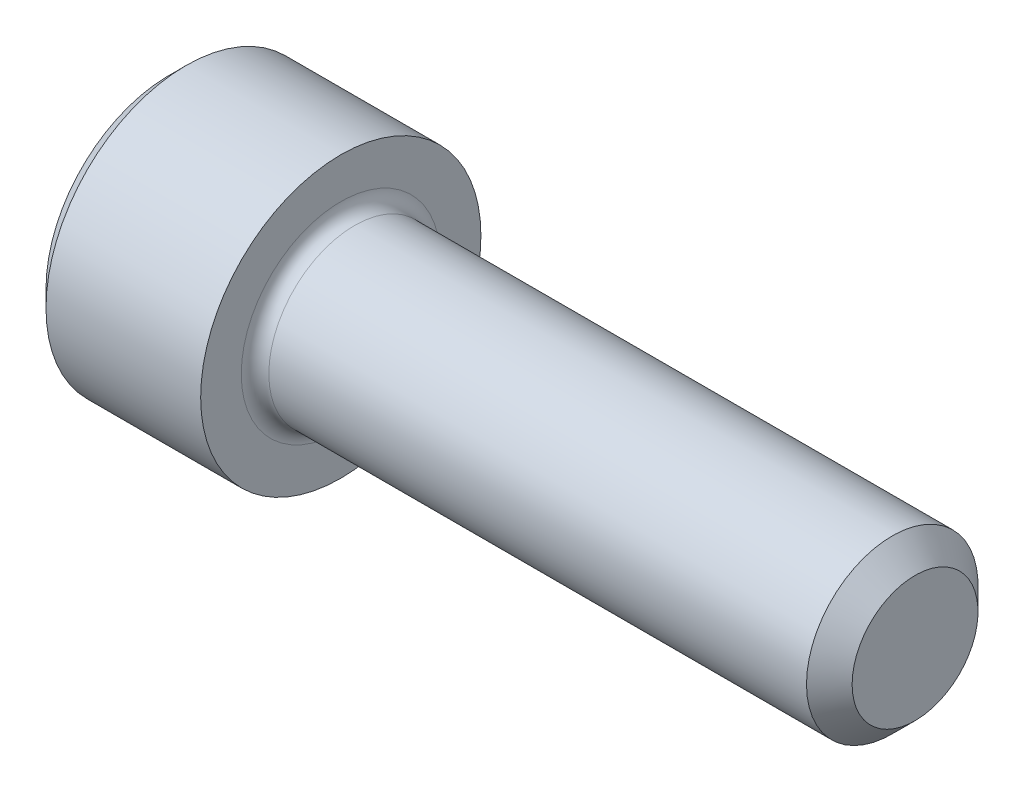
ISO-10303-21;
HEADER;
FILE_DESCRIPTION(('STEP AP214'),'2;1');
FILE_NAME('part.step','',(''),(''),'','','');
FILE_SCHEMA(('AUTOMOTIVE_DESIGN { 1 0 10303 214 1 1 1 1 }'));
ENDSEC;
DATA;
#1=APPLICATION_CONTEXT('core data for automotive mechanical design processes');
#2=APPLICATION_PROTOCOL_DEFINITION('international standard','automotive_design',2000,#1);
#3=PRODUCT_CONTEXT('',#1,'mechanical');
#4=PRODUCT('Part','Part','',(#3));
#5=PRODUCT_RELATED_PRODUCT_CATEGORY('part','',(#4));
#6=PRODUCT_DEFINITION_FORMATION('','',#4);
#7=PRODUCT_DEFINITION_CONTEXT('part definition',#1,'design');
#8=PRODUCT_DEFINITION('design','',#6,#7);
#9=PRODUCT_DEFINITION_SHAPE('','',#8);
#10=(LENGTH_UNIT() NAMED_UNIT(*) SI_UNIT(.MILLI.,.METRE.));
#11=(NAMED_UNIT(*) PLANE_ANGLE_UNIT() SI_UNIT($,.RADIAN.));
#12=(NAMED_UNIT(*) SI_UNIT($,.STERADIAN.) SOLID_ANGLE_UNIT());
#13=UNCERTAINTY_MEASURE_WITH_UNIT(LENGTH_MEASURE(1.E-05),#10,'distance_accuracy_value','');
#14=(GEOMETRIC_REPRESENTATION_CONTEXT(3) GLOBAL_UNCERTAINTY_ASSIGNED_CONTEXT((#13)) GLOBAL_UNIT_ASSIGNED_CONTEXT((#10,
#11,#12)) REPRESENTATION_CONTEXT('',''));
#15=CARTESIAN_POINT('',(0.,0.,0.));
#16=DIRECTION('',(0.,0.,1.));
#17=DIRECTION('',(1.,0.,0.));
#18=AXIS2_PLACEMENT_3D('',#15,#16,#17);
#19=CARTESIAN_POINT('',(0.,0.,0.));
#20=DIRECTION('',(-1.,0.,0.));
#21=DIRECTION('',(0.,0.,1.));
#22=AXIS2_PLACEMENT_3D('',#19,#20,#21);
#23=PLANE('',#22);
#24=DIRECTION('',(0.,-0.499999999999999,0.866025403784439));
#25=VECTOR('',#24,1.);
#26=CARTESIAN_POINT('',(0.,1.37848150271716,0.));
#27=LINE('',#26,#25);
#28=CARTESIAN_POINT('',(0.,1.37848150271716,0.));
#29=VERTEX_POINT('',#28);
#30=CARTESIAN_POINT('',(0.,0.689240751358582,1.1938));
#31=VERTEX_POINT('',#30);
#32=EDGE_CURVE('E121',#29,#31,#27,.T.);
#33=ORIENTED_EDGE('',*,*,#32,.T.);
#34=DIRECTION('',(0.,1.,0.));
#35=VECTOR('',#34,1.);
#36=CARTESIAN_POINT('',(0.,-0.689240751358569,1.1938));
#37=LINE('',#36,#35);
#38=CARTESIAN_POINT('',(0.,-0.689240751358569,1.1938));
#39=VERTEX_POINT('',#38);
#40=EDGE_CURVE('E110',#39,#31,#37,.T.);
#41=ORIENTED_EDGE('',*,*,#40,.F.);
#42=DIRECTION('',(0.,-0.500000000000001,-0.866025403784438));
#43=VECTOR('',#42,1.);
#44=CARTESIAN_POINT('',(0.,-0.689240751358569,1.1938));
#45=LINE('',#44,#43);
#46=CARTESIAN_POINT('',(0.,-1.37848150271715,0.));
#47=VERTEX_POINT('',#46);
#48=EDGE_CURVE('E120',#39,#47,#45,.T.);
#49=ORIENTED_EDGE('',*,*,#48,.T.);
#50=DIRECTION('',(0.,0.499999999999999,-0.866025403784439));
#51=VECTOR('',#50,1.);
#52=CARTESIAN_POINT('',(0.,-1.37848150271715,0.));
#53=LINE('',#52,#51);
#54=CARTESIAN_POINT('',(0.,-0.689240751358572,-1.1938));
#55=VERTEX_POINT('',#54);
#56=EDGE_CURVE('E135',#47,#55,#53,.T.);
#57=ORIENTED_EDGE('',*,*,#56,.T.);
#58=DIRECTION('',(0.,-1.,0.));
#59=VECTOR('',#58,1.);
#60=CARTESIAN_POINT('',(0.,0.689240751358578,-1.1938));
#61=LINE('',#60,#59);
#62=CARTESIAN_POINT('',(0.,0.689240751358578,-1.1938));
#63=VERTEX_POINT('',#62);
#64=EDGE_CURVE('E138',#63,#55,#61,.T.);
#65=ORIENTED_EDGE('',*,*,#64,.F.);
#66=DIRECTION('',(0.,-0.500000000000001,-0.866025403784438));
#67=VECTOR('',#66,1.);
#68=CARTESIAN_POINT('',(0.,1.37848150271716,0.));
#69=LINE('',#68,#67);
#70=EDGE_CURVE('E130',#29,#63,#69,.T.);
#71=ORIENTED_EDGE('',*,*,#70,.F.);
#72=EDGE_LOOP('',(#33,#41,#49,#57,#65,#71));
#73=FACE_BOUND('',#72,.T.);
#74=CARTESIAN_POINT('',(0.,0.,0.));
#75=DIRECTION('',(-1.,0.,0.));
#76=DIRECTION('',(0.,0.,1.));
#77=AXIS2_PLACEMENT_3D('',#74,#75,#76);
#78=CIRCLE('',#77,2.04469999999999);
#79=CARTESIAN_POINT('',(0.,0.,2.04469999999999));
#80=VERTEX_POINT('',#79);
#81=EDGE_CURVE('E190',#80,#80,#78,.T.);
#82=ORIENTED_EDGE('',*,*,#81,.T.);
#83=EDGE_LOOP('',(#82));
#84=FACE_BOUND('',#83,.T.);
#85=ADVANCED_FACE('F38',(#73,#84),#23,.T.);
#86=CARTESIAN_POINT('',(0.,0.,0.));
#87=DIRECTION('',(1.,0.,0.));
#88=DIRECTION('',(0.,0.,-1.));
#89=AXIS2_PLACEMENT_3D('',#86,#87,#88);
#90=CONICAL_SURFACE('',#89,2.04469999999999,0.785398163397459);
#91=CARTESIAN_POINT('',(0.279400000000006,0.,0.));
#92=DIRECTION('',(-1.,0.,0.));
#93=DIRECTION('',(0.,0.,1.));
#94=AXIS2_PLACEMENT_3D('',#91,#92,#93);
#95=CIRCLE('',#94,2.3241);
#96=CARTESIAN_POINT('',(0.279400000000006,0.,2.3241));
#97=VERTEX_POINT('',#96);
#98=EDGE_CURVE('E187',#97,#97,#95,.T.);
#99=ORIENTED_EDGE('',*,*,#98,.T.);
#100=EDGE_LOOP('',(#99));
#101=FACE_BOUND('',#100,.T.);
#102=ORIENTED_EDGE('',*,*,#81,.F.);
#103=EDGE_LOOP('',(#102));
#104=FACE_BOUND('',#103,.T.);
#105=ADVANCED_FACE('F214',(#101,#104),#90,.T.);
#106=CARTESIAN_POINT('',(-31.75,0.,0.));
#107=DIRECTION('',(-1.,0.,0.));
#108=DIRECTION('',(0.,0.,1.));
#109=AXIS2_PLACEMENT_3D('',#106,#107,#108);
#110=CYLINDRICAL_SURFACE('',#109,2.3241);
#111=CARTESIAN_POINT('',(2.84480000000001,0.,0.));
#112=DIRECTION('',(-1.,0.,0.));
#113=DIRECTION('',(0.,0.,1.));
#114=AXIS2_PLACEMENT_3D('',#111,#112,#113);
#115=CIRCLE('',#114,2.3241);
#116=CARTESIAN_POINT('',(2.84480000000001,0.,2.3241));
#117=VERTEX_POINT('',#116);
#118=EDGE_CURVE('E184',#117,#117,#115,.T.);
#119=ORIENTED_EDGE('',*,*,#118,.T.);
#120=EDGE_LOOP('',(#119));
#121=FACE_BOUND('',#120,.T.);
#122=ORIENTED_EDGE('',*,*,#98,.F.);
#123=EDGE_LOOP('',(#122));
#124=FACE_BOUND('',#123,.T.);
#125=ADVANCED_FACE('F218',(#121,#124),#110,.T.);
#126=CARTESIAN_POINT('',(2.84480000000001,2.3241,0.));
#127=DIRECTION('',(1.,0.,0.));
#128=DIRECTION('',(0.,0.,-1.));
#129=AXIS2_PLACEMENT_3D('',#126,#127,#128);
#130=PLANE('',#129);
#131=CARTESIAN_POINT('',(2.84480000000001,0.,0.));
#132=DIRECTION('',(1.,0.,0.));
#133=DIRECTION('',(0.,0.,-1.));
#134=AXIS2_PLACEMENT_3D('',#131,#132,#133);
#135=CIRCLE('',#134,1.651);
#136=CARTESIAN_POINT('',(2.84480000000001,0.,-1.651));
#137=VERTEX_POINT('',#136);
#138=EDGE_CURVE('E45',#137,#137,#135,.F.);
#139=ORIENTED_EDGE('',*,*,#138,.T.);
#140=EDGE_LOOP('',(#139));
#141=FACE_BOUND('',#140,.T.);
#142=ORIENTED_EDGE('',*,*,#118,.F.);
#143=EDGE_LOOP('',(#142));
#144=FACE_BOUND('',#143,.T.);
#145=ADVANCED_FACE('F195',(#141,#144),#130,.T.);
#146=CARTESIAN_POINT('',(-31.75,0.,0.));
#147=DIRECTION('',(-1.,0.,0.));
#148=DIRECTION('',(0.,0.,1.));
#149=AXIS2_PLACEMENT_3D('',#146,#147,#148);
#150=CYLINDRICAL_SURFACE('',#149,1.4224);
#151=CARTESIAN_POINT('',(3.0734,0.,0.));
#152=DIRECTION('',(1.,0.,0.));
#153=DIRECTION('',(0.,0.,-1.));
#154=AXIS2_PLACEMENT_3D('',#151,#152,#153);
#155=CIRCLE('',#154,1.4224);
#156=CARTESIAN_POINT('',(3.0734,0.,-1.4224));
#157=VERTEX_POINT('',#156);
#158=EDGE_CURVE('E11',#157,#157,#155,.T.);
#159=ORIENTED_EDGE('',*,*,#158,.T.);
#160=EDGE_LOOP('',(#159));
#161=FACE_BOUND('',#160,.T.);
#162=CARTESIAN_POINT('',(11.99134,0.,0.));
#163=DIRECTION('',(-1.,0.,0.));
#164=DIRECTION('',(0.,0.,1.));
#165=AXIS2_PLACEMENT_3D('',#162,#163,#164);
#166=CIRCLE('',#165,1.4224);
#167=CARTESIAN_POINT('',(11.99134,0.,1.4224));
#168=VERTEX_POINT('',#167);
#169=EDGE_CURVE('E181',#168,#168,#166,.T.);
#170=ORIENTED_EDGE('',*,*,#169,.T.);
#171=EDGE_LOOP('',(#170));
#172=FACE_BOUND('',#171,.T.);
#173=ADVANCED_FACE('F229',(#161,#172),#150,.T.);
#174=CARTESIAN_POINT('',(12.3698,0.,0.));
#175=DIRECTION('',(-1.,0.,0.));
#176=DIRECTION('',(0.,0.,1.));
#177=AXIS2_PLACEMENT_3D('',#174,#175,#176);
#178=CONICAL_SURFACE('',#177,1.04394,0.785398163397447);
#179=ORIENTED_EDGE('',*,*,#169,.F.);
#180=EDGE_LOOP('',(#179));
#181=FACE_BOUND('',#180,.T.);
#182=CARTESIAN_POINT('',(12.3698,0.,0.));
#183=DIRECTION('',(-1.,0.,0.));
#184=DIRECTION('',(0.,0.,1.));
#185=AXIS2_PLACEMENT_3D('',#182,#183,#184);
#186=CIRCLE('',#185,1.04394);
#187=CARTESIAN_POINT('',(12.3698,0.,1.04394));
#188=VERTEX_POINT('',#187);
#189=EDGE_CURVE('E177',#188,#188,#186,.T.);
#190=ORIENTED_EDGE('',*,*,#189,.T.);
#191=EDGE_LOOP('',(#190));
#192=FACE_BOUND('',#191,.T.);
#193=ADVANCED_FACE('F208',(#181,#192),#178,.T.);
#194=CARTESIAN_POINT('',(12.3698,1.04394,0.));
#195=DIRECTION('',(1.,0.,0.));
#196=DIRECTION('',(0.,0.,-1.));
#197=AXIS2_PLACEMENT_3D('',#194,#195,#196);
#198=PLANE('',#197);
#199=ORIENTED_EDGE('',*,*,#189,.F.);
#200=EDGE_LOOP('',(#199));
#201=FACE_BOUND('',#200,.T.);
#202=ADVANCED_FACE('F200',(#201),#198,.T.);
#203=CARTESIAN_POINT('',(3.0734,0.,0.));
#204=DIRECTION('',(1.,0.,0.));
#205=DIRECTION('',(0.,0.,-1.));
#206=AXIS2_PLACEMENT_3D('',#203,#204,#205);
#207=TOROIDAL_SURFACE('',#206,1.651,0.2286);
#208=ORIENTED_EDGE('',*,*,#158,.F.);
#209=EDGE_LOOP('',(#208));
#210=FACE_BOUND('',#209,.T.);
#211=ORIENTED_EDGE('',*,*,#138,.F.);
#212=EDGE_LOOP('',(#211));
#213=FACE_BOUND('',#212,.T.);
#214=ADVANCED_FACE('F198',(#210,#213),#207,.F.);
#215=CARTESIAN_POINT('',(1.2954,1.37848150271716,0.));
#216=DIRECTION('',(0.,-0.866025403784439,-0.499999999999999));
#217=DIRECTION('',(0.,0.499999999999999,-0.866025403784439));
#218=AXIS2_PLACEMENT_3D('',#215,#216,#217);
#219=PLANE('',#218);
#220=ORIENTED_EDGE('',*,*,#32,.F.);
#221=DIRECTION('',(-1.,0.,0.));
#222=VECTOR('',#221,1.);
#223=CARTESIAN_POINT('',(1.2954,1.37848150271716,0.));
#224=LINE('',#223,#222);
#225=CARTESIAN_POINT('',(1.2954,1.37848150271716,0.));
#226=VERTEX_POINT('',#225);
#227=EDGE_CURVE('E162',#226,#29,#224,.T.);
#228=ORIENTED_EDGE('',*,*,#227,.F.);
#229=DIRECTION('',(0.,-0.499999999999999,0.866025403784439));
#230=VECTOR('',#229,1.);
#231=CARTESIAN_POINT('',(1.2954,1.37848150271716,0.));
#232=LINE('',#231,#230);
#233=CARTESIAN_POINT('',(1.29540000000001,1.03386112703786,0.596899999999998));
#234=VERTEX_POINT('',#233);
#235=EDGE_CURVE('E52',#226,#234,#232,.T.);
#236=ORIENTED_EDGE('',*,*,#235,.T.);
#237=CARTESIAN_POINT('',(1.2954,0.689240751358582,1.1938));
#238=VERTEX_POINT('',#237);
#239=EDGE_CURVE('E125',#234,#238,#232,.T.);
#240=ORIENTED_EDGE('',*,*,#239,.T.);
#241=DIRECTION('',(-1.,0.,0.));
#242=VECTOR('',#241,1.);
#243=CARTESIAN_POINT('',(1.2954,0.689240751358582,1.1938));
#244=LINE('',#243,#242);
#245=EDGE_CURVE('E114',#238,#31,#244,.T.);
#246=ORIENTED_EDGE('',*,*,#245,.T.);
#247=EDGE_LOOP('',(#220,#228,#236,#240,#246));
#248=FACE_BOUND('',#247,.T.);
#249=ADVANCED_FACE('F123',(#248),#219,.T.);
#250=CARTESIAN_POINT('',(1.2954,-0.689240751358569,1.1938));
#251=DIRECTION('',(0.,0.,1.));
#252=DIRECTION('',(0.,-1.,0.));
#253=AXIS2_PLACEMENT_3D('',#250,#251,#252);
#254=PLANE('',#253);
#255=ORIENTED_EDGE('',*,*,#40,.T.);
#256=ORIENTED_EDGE('',*,*,#245,.F.);
#257=DIRECTION('',(0.,1.,0.));
#258=VECTOR('',#257,1.);
#259=CARTESIAN_POINT('',(1.2954,-0.689240751358569,1.1938));
#260=LINE('',#259,#258);
#261=CARTESIAN_POINT('',(1.2954,0.,1.1938));
#262=VERTEX_POINT('',#261);
#263=EDGE_CURVE('E142',#262,#238,#260,.T.);
#264=ORIENTED_EDGE('',*,*,#263,.F.);
#265=CARTESIAN_POINT('',(1.2954,-0.689240751358569,1.1938));
#266=VERTEX_POINT('',#265);
#267=EDGE_CURVE('E143',#266,#262,#260,.T.);
#268=ORIENTED_EDGE('',*,*,#267,.F.);
#269=DIRECTION('',(-1.,0.,0.));
#270=VECTOR('',#269,1.);
#271=CARTESIAN_POINT('',(1.2954,-0.689240751358569,1.1938));
#272=LINE('',#271,#270);
#273=EDGE_CURVE('E116',#266,#39,#272,.T.);
#274=ORIENTED_EDGE('',*,*,#273,.T.);
#275=EDGE_LOOP('',(#255,#256,#264,#268,#274));
#276=FACE_BOUND('',#275,.T.);
#277=ADVANCED_FACE('F112',(#276),#254,.F.);
#278=CARTESIAN_POINT('',(1.2954,-0.689240751358569,1.1938));
#279=DIRECTION('',(0.,0.866025403784438,-0.500000000000001));
#280=DIRECTION('',(0.,0.500000000000001,0.866025403784438));
#281=AXIS2_PLACEMENT_3D('',#278,#279,#280);
#282=PLANE('',#281);
#283=ORIENTED_EDGE('',*,*,#48,.F.);
#284=ORIENTED_EDGE('',*,*,#273,.F.);
#285=DIRECTION('',(0.,-0.500000000000001,-0.866025403784438));
#286=VECTOR('',#285,1.);
#287=CARTESIAN_POINT('',(1.2954,-0.689240751358569,1.1938));
#288=LINE('',#287,#286);
#289=CARTESIAN_POINT('',(1.2954,-1.03386112703786,0.596899999999999));
#290=VERTEX_POINT('',#289);
#291=EDGE_CURVE('E147',#266,#290,#288,.T.);
#292=ORIENTED_EDGE('',*,*,#291,.T.);
#293=CARTESIAN_POINT('',(1.2954,-1.37848150271715,0.));
#294=VERTEX_POINT('',#293);
#295=EDGE_CURVE('E146',#290,#294,#288,.T.);
#296=ORIENTED_EDGE('',*,*,#295,.T.);
#297=DIRECTION('',(-1.,0.,0.));
#298=VECTOR('',#297,1.);
#299=CARTESIAN_POINT('',(1.2954,-1.37848150271715,0.));
#300=LINE('',#299,#298);
#301=EDGE_CURVE('E170',#294,#47,#300,.T.);
#302=ORIENTED_EDGE('',*,*,#301,.T.);
#303=EDGE_LOOP('',(#283,#284,#292,#296,#302));
#304=FACE_BOUND('',#303,.T.);
#305=ADVANCED_FACE('F286',(#304),#282,.T.);
#306=CARTESIAN_POINT('',(1.2954,-1.37848150271715,0.));
#307=DIRECTION('',(0.,0.866025403784439,0.499999999999999));
#308=DIRECTION('',(0.,-0.499999999999999,0.866025403784439));
#309=AXIS2_PLACEMENT_3D('',#306,#307,#308);
#310=PLANE('',#309);
#311=ORIENTED_EDGE('',*,*,#56,.F.);
#312=ORIENTED_EDGE('',*,*,#301,.F.);
#313=DIRECTION('',(0.,0.499999999999999,-0.866025403784439));
#314=VECTOR('',#313,1.);
#315=CARTESIAN_POINT('',(1.2954,-1.37848150271715,0.));
#316=LINE('',#315,#314);
#317=CARTESIAN_POINT('',(1.2954,-1.03386112703786,-0.596899999999997));
#318=VERTEX_POINT('',#317);
#319=EDGE_CURVE('E151',#294,#318,#316,.T.);
#320=ORIENTED_EDGE('',*,*,#319,.T.);
#321=CARTESIAN_POINT('',(1.2954,-0.689240751358572,-1.1938));
#322=VERTEX_POINT('',#321);
#323=EDGE_CURVE('E150',#318,#322,#316,.T.);
#324=ORIENTED_EDGE('',*,*,#323,.T.);
#325=DIRECTION('',(-1.,0.,0.));
#326=VECTOR('',#325,1.);
#327=CARTESIAN_POINT('',(1.2954,-0.689240751358572,-1.1938));
#328=LINE('',#327,#326);
#329=EDGE_CURVE('E167',#322,#55,#328,.T.);
#330=ORIENTED_EDGE('',*,*,#329,.T.);
#331=EDGE_LOOP('',(#311,#312,#320,#324,#330));
#332=FACE_BOUND('',#331,.T.);
#333=ADVANCED_FACE('F295',(#332),#310,.T.);
#334=CARTESIAN_POINT('',(1.2954,0.689240751358578,-1.1938));
#335=DIRECTION('',(0.,0.,-1.));
#336=DIRECTION('',(0.,1.,0.));
#337=AXIS2_PLACEMENT_3D('',#334,#335,#336);
#338=PLANE('',#337);
#339=ORIENTED_EDGE('',*,*,#64,.T.);
#340=ORIENTED_EDGE('',*,*,#329,.F.);
#341=DIRECTION('',(0.,-1.,0.));
#342=VECTOR('',#341,1.);
#343=CARTESIAN_POINT('',(1.2954,0.689240751358578,-1.1938));
#344=LINE('',#343,#342);
#345=CARTESIAN_POINT('',(1.2954,0.,-1.1938));
#346=VERTEX_POINT('',#345);
#347=EDGE_CURVE('E154',#346,#322,#344,.T.);
#348=ORIENTED_EDGE('',*,*,#347,.F.);
#349=CARTESIAN_POINT('',(1.2954,0.689240751358578,-1.1938));
#350=VERTEX_POINT('',#349);
#351=EDGE_CURVE('E155',#350,#346,#344,.T.);
#352=ORIENTED_EDGE('',*,*,#351,.F.);
#353=DIRECTION('',(-1.,0.,0.));
#354=VECTOR('',#353,1.);
#355=CARTESIAN_POINT('',(1.2954,0.689240751358578,-1.1938));
#356=LINE('',#355,#354);
#357=EDGE_CURVE('E164',#350,#63,#356,.T.);
#358=ORIENTED_EDGE('',*,*,#357,.T.);
#359=EDGE_LOOP('',(#339,#340,#348,#352,#358));
#360=FACE_BOUND('',#359,.T.);
#361=ADVANCED_FACE('F305',(#360),#338,.F.);
#362=CARTESIAN_POINT('',(1.2954,1.37848150271716,0.));
#363=DIRECTION('',(0.,0.866025403784438,-0.500000000000001));
#364=DIRECTION('',(0.,0.500000000000001,0.866025403784438));
#365=AXIS2_PLACEMENT_3D('',#362,#363,#364);
#366=PLANE('',#365);
#367=ORIENTED_EDGE('',*,*,#70,.T.);
#368=ORIENTED_EDGE('',*,*,#357,.F.);
#369=DIRECTION('',(0.,-0.500000000000001,-0.866025403784438));
#370=VECTOR('',#369,1.);
#371=CARTESIAN_POINT('',(1.2954,1.37848150271716,0.));
#372=LINE('',#371,#370);
#373=CARTESIAN_POINT('',(1.2954,1.03386112703787,-0.596900000000004));
#374=VERTEX_POINT('',#373);
#375=EDGE_CURVE('E158',#374,#350,#372,.T.);
#376=ORIENTED_EDGE('',*,*,#375,.F.);
#377=EDGE_CURVE('E159',#226,#374,#372,.T.);
#378=ORIENTED_EDGE('',*,*,#377,.F.);
#379=ORIENTED_EDGE('',*,*,#227,.T.);
#380=EDGE_LOOP('',(#367,#368,#376,#378,#379));
#381=FACE_BOUND('',#380,.T.);
#382=ADVANCED_FACE('F315',(#381),#366,.F.);
#383=CARTESIAN_POINT('',(1.2954,0.689240751358581,1.1938));
#384=DIRECTION('',(-1.,0.,0.));
#385=DIRECTION('',(0.,0.,1.));
#386=AXIS2_PLACEMENT_3D('',#383,#384,#385);
#387=PLANE('',#386);
#388=CARTESIAN_POINT('',(1.29540000000001,0.,0.));
#389=DIRECTION('',(-1.,0.,0.));
#390=DIRECTION('',(0.,0.,1.));
#391=AXIS2_PLACEMENT_3D('',#388,#389,#390);
#392=CIRCLE('',#391,1.1938);
#393=EDGE_CURVE('E126',#290,#262,#392,.T.);
#394=ORIENTED_EDGE('',*,*,#393,.F.);
#395=ORIENTED_EDGE('',*,*,#291,.F.);
#396=ORIENTED_EDGE('',*,*,#267,.T.);
#397=EDGE_LOOP('',(#394,#395,#396));
#398=FACE_BOUND('',#397,.T.);
#399=ADVANCED_FACE('F325',(#398),#387,.T.);
#400=EDGE_CURVE('E401',#318,#290,#392,.T.);
#401=ORIENTED_EDGE('',*,*,#400,.F.);
#402=ORIENTED_EDGE('',*,*,#319,.F.);
#403=ORIENTED_EDGE('',*,*,#295,.F.);
#404=EDGE_LOOP('',(#401,#402,#403));
#405=FACE_BOUND('',#404,.T.);
#406=ADVANCED_FACE('F335',(#405),#387,.T.);
#407=EDGE_CURVE('E402',#346,#318,#392,.T.);
#408=ORIENTED_EDGE('',*,*,#407,.F.);
#409=ORIENTED_EDGE('',*,*,#347,.T.);
#410=ORIENTED_EDGE('',*,*,#323,.F.);
#411=EDGE_LOOP('',(#408,#409,#410));
#412=FACE_BOUND('',#411,.T.);
#413=ADVANCED_FACE('F346',(#412),#387,.T.);
#414=EDGE_CURVE('E405',#374,#346,#392,.T.);
#415=ORIENTED_EDGE('',*,*,#414,.F.);
#416=ORIENTED_EDGE('',*,*,#375,.T.);
#417=ORIENTED_EDGE('',*,*,#351,.T.);
#418=EDGE_LOOP('',(#415,#416,#417));
#419=FACE_BOUND('',#418,.T.);
#420=ADVANCED_FACE('F355',(#419),#387,.T.);
#421=EDGE_CURVE('E178',#234,#374,#392,.T.);
#422=ORIENTED_EDGE('',*,*,#421,.F.);
#423=ORIENTED_EDGE('',*,*,#235,.F.);
#424=ORIENTED_EDGE('',*,*,#377,.T.);
#425=EDGE_LOOP('',(#422,#423,#424));
#426=FACE_BOUND('',#425,.T.);
#427=ADVANCED_FACE('F364',(#426),#387,.T.);
#428=EDGE_CURVE('E174',#262,#234,#392,.T.);
#429=ORIENTED_EDGE('',*,*,#428,.F.);
#430=ORIENTED_EDGE('',*,*,#263,.T.);
#431=ORIENTED_EDGE('',*,*,#239,.F.);
#432=EDGE_LOOP('',(#429,#430,#431));
#433=FACE_BOUND('',#432,.T.);
#434=ADVANCED_FACE('F338',(#433),#387,.T.);
#435=CARTESIAN_POINT('',(1.29540000000001,0.,0.));
#436=DIRECTION('',(-1.,0.,0.));
#437=DIRECTION('',(0.,0.,1.));
#438=AXIS2_PLACEMENT_3D('',#435,#436,#437);
#439=CONICAL_SURFACE('',#438,1.1938,1.04719755119659);
#440=CARTESIAN_POINT('',(1.98464075135859,0.,0.));
#441=VERTEX_POINT('',#440);
#442=VERTEX_LOOP('',#441);
#443=FACE_BOUND('',#442,.T.);
#444=ORIENTED_EDGE('',*,*,#428,.T.);
#445=ORIENTED_EDGE('',*,*,#421,.T.);
#446=ORIENTED_EDGE('',*,*,#414,.T.);
#447=ORIENTED_EDGE('',*,*,#407,.T.);
#448=ORIENTED_EDGE('',*,*,#400,.T.);
#449=ORIENTED_EDGE('',*,*,#393,.T.);
#450=EDGE_LOOP('',(#444,#445,#446,#447,#448,#449));
#451=FACE_BOUND('',#450,.T.);
#452=ADVANCED_FACE('F381',(#443,#451),#439,.F.);
#453=CLOSED_SHELL('',(#85,#105,#125,#145,#173,#193,#202,#214,#249,#277,#305,#333,#361,#382,#399,
#406,#413,#420,#427,#434,#452));
#454=MANIFOLD_SOLID_BREP('B2',#453);
#455=ADVANCED_BREP_SHAPE_REPRESENTATION('',(#18,#454),#14);
#456=SHAPE_DEFINITION_REPRESENTATION(#9,#455);
ENDSEC;
END-ISO-10303-21;
